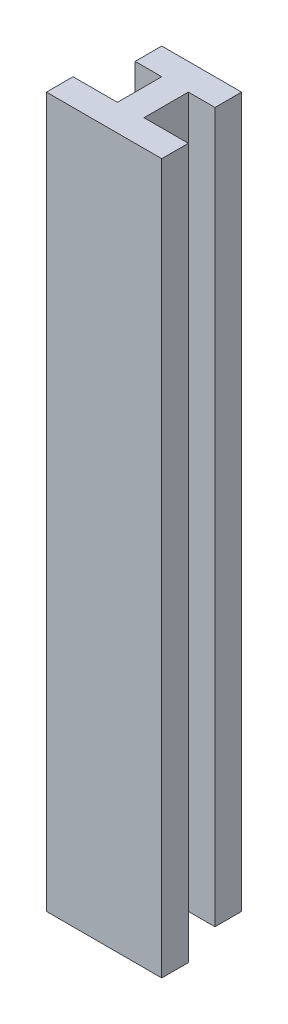
ISO-10303-21;
HEADER;
FILE_DESCRIPTION(('STEP AP214'),'2;1');
FILE_NAME('part.step','',(''),(''),'','','');
FILE_SCHEMA(('AUTOMOTIVE_DESIGN { 1 0 10303 214 1 1 1 1 }'));
ENDSEC;
DATA;
#1=APPLICATION_CONTEXT('core data for automotive mechanical design processes');
#2=APPLICATION_PROTOCOL_DEFINITION('international standard','automotive_design',2000,#1);
#3=PRODUCT_CONTEXT('',#1,'mechanical');
#4=PRODUCT('Part','Part','',(#3));
#5=PRODUCT_RELATED_PRODUCT_CATEGORY('part','',(#4));
#6=PRODUCT_DEFINITION_FORMATION('','',#4);
#7=PRODUCT_DEFINITION_CONTEXT('part definition',#1,'design');
#8=PRODUCT_DEFINITION('design','',#6,#7);
#9=PRODUCT_DEFINITION_SHAPE('','',#8);
#10=(LENGTH_UNIT() NAMED_UNIT(*) SI_UNIT(.MILLI.,.METRE.));
#11=(NAMED_UNIT(*) PLANE_ANGLE_UNIT() SI_UNIT($,.RADIAN.));
#12=(NAMED_UNIT(*) SI_UNIT($,.STERADIAN.) SOLID_ANGLE_UNIT());
#13=UNCERTAINTY_MEASURE_WITH_UNIT(LENGTH_MEASURE(1.E-05),#10,'distance_accuracy_value','');
#14=(GEOMETRIC_REPRESENTATION_CONTEXT(3) GLOBAL_UNCERTAINTY_ASSIGNED_CONTEXT((#13)) GLOBAL_UNIT_ASSIGNED_CONTEXT((#10,
#11,#12)) REPRESENTATION_CONTEXT('',''));
#15=CARTESIAN_POINT('',(0.,0.,0.));
#16=DIRECTION('',(0.,0.,1.));
#17=DIRECTION('',(1.,0.,0.));
#18=AXIS2_PLACEMENT_3D('',#15,#16,#17);
#19=CARTESIAN_POINT('',(0.,80.,0.));
#20=DIRECTION('',(1.,0.,0.));
#21=DIRECTION('',(0.,0.,-1.));
#22=AXIS2_PLACEMENT_3D('',#19,#20,#21);
#23=PLANE('',#22);
#24=DIRECTION('',(0.,0.,1.));
#25=VECTOR('',#24,1.);
#26=CARTESIAN_POINT('',(0.,0.,0.));
#27=LINE('',#26,#25);
#28=CARTESIAN_POINT('',(0.,0.,-3.));
#29=VERTEX_POINT('',#28);
#30=CARTESIAN_POINT('',(0.,0.,0.));
#31=VERTEX_POINT('',#30);
#32=EDGE_CURVE('E168',#29,#31,#27,.T.);
#33=ORIENTED_EDGE('',*,*,#32,.T.);
#34=DIRECTION('',(0.,-1.,0.));
#35=VECTOR('',#34,1.);
#36=CARTESIAN_POINT('',(0.,80.,0.));
#37=LINE('',#36,#35);
#38=CARTESIAN_POINT('',(0.,80.,0.));
#39=VERTEX_POINT('',#38);
#40=EDGE_CURVE('E11',#39,#31,#37,.T.);
#41=ORIENTED_EDGE('',*,*,#40,.F.);
#42=DIRECTION('',(0.,0.,1.));
#43=VECTOR('',#42,1.);
#44=CARTESIAN_POINT('',(0.,80.,0.));
#45=LINE('',#44,#43);
#46=CARTESIAN_POINT('',(0.,80.,-3.));
#47=VERTEX_POINT('',#46);
#48=EDGE_CURVE('E202',#47,#39,#45,.T.);
#49=ORIENTED_EDGE('',*,*,#48,.F.);
#50=DIRECTION('',(0.,-1.,0.));
#51=VECTOR('',#50,1.);
#52=CARTESIAN_POINT('',(0.,80.,-3.));
#53=LINE('',#52,#51);
#54=EDGE_CURVE('E164',#47,#29,#53,.T.);
#55=ORIENTED_EDGE('',*,*,#54,.T.);
#56=EDGE_LOOP('',(#33,#41,#49,#55));
#57=FACE_BOUND('',#56,.T.);
#58=ADVANCED_FACE('F43',(#57),#23,.F.);
#59=CARTESIAN_POINT('',(0.,80.,0.));
#60=DIRECTION('',(0.,0.,-1.));
#61=DIRECTION('',(-1.,0.,0.));
#62=AXIS2_PLACEMENT_3D('',#59,#60,#61);
#63=PLANE('',#62);
#64=DIRECTION('',(1.,0.,0.));
#65=VECTOR('',#64,1.);
#66=CARTESIAN_POINT('',(0.,0.,0.));
#67=LINE('',#66,#65);
#68=CARTESIAN_POINT('',(13.,0.,0.));
#69=VERTEX_POINT('',#68);
#70=EDGE_CURVE('E172',#31,#69,#67,.T.);
#71=ORIENTED_EDGE('',*,*,#70,.T.);
#72=DIRECTION('',(0.,-1.,0.));
#73=VECTOR('',#72,1.);
#74=CARTESIAN_POINT('',(13.,80.,0.));
#75=LINE('',#74,#73);
#76=CARTESIAN_POINT('',(13.,80.,0.));
#77=VERTEX_POINT('',#76);
#78=EDGE_CURVE('E52',#77,#69,#75,.T.);
#79=ORIENTED_EDGE('',*,*,#78,.F.);
#80=DIRECTION('',(1.,0.,0.));
#81=VECTOR('',#80,1.);
#82=CARTESIAN_POINT('',(0.,80.,0.));
#83=LINE('',#82,#81);
#84=EDGE_CURVE('E115',#39,#77,#83,.T.);
#85=ORIENTED_EDGE('',*,*,#84,.F.);
#86=ORIENTED_EDGE('',*,*,#40,.T.);
#87=EDGE_LOOP('',(#71,#79,#85,#86));
#88=FACE_BOUND('',#87,.T.);
#89=ADVANCED_FACE('F296',(#88),#63,.F.);
#90=CARTESIAN_POINT('',(13.,80.,0.));
#91=DIRECTION('',(-1.,0.,0.));
#92=DIRECTION('',(0.,0.,1.));
#93=AXIS2_PLACEMENT_3D('',#90,#91,#92);
#94=PLANE('',#93);
#95=DIRECTION('',(0.,0.,-1.));
#96=VECTOR('',#95,1.);
#97=CARTESIAN_POINT('',(13.,0.,0.));
#98=LINE('',#97,#96);
#99=CARTESIAN_POINT('',(13.,0.,-3.));
#100=VERTEX_POINT('',#99);
#101=EDGE_CURVE('E175',#69,#100,#98,.T.);
#102=ORIENTED_EDGE('',*,*,#101,.T.);
#103=DIRECTION('',(0.,-1.,0.));
#104=VECTOR('',#103,1.);
#105=CARTESIAN_POINT('',(13.,80.,-3.));
#106=LINE('',#105,#104);
#107=CARTESIAN_POINT('',(13.,80.,-3.));
#108=VERTEX_POINT('',#107);
#109=EDGE_CURVE('E229',#108,#100,#106,.T.);
#110=ORIENTED_EDGE('',*,*,#109,.F.);
#111=DIRECTION('',(0.,0.,-1.));
#112=VECTOR('',#111,1.);
#113=CARTESIAN_POINT('',(13.,80.,0.));
#114=LINE('',#113,#112);
#115=EDGE_CURVE('E239',#77,#108,#114,.T.);
#116=ORIENTED_EDGE('',*,*,#115,.F.);
#117=ORIENTED_EDGE('',*,*,#78,.T.);
#118=EDGE_LOOP('',(#102,#110,#116,#117));
#119=FACE_BOUND('',#118,.T.);
#120=ADVANCED_FACE('F237',(#119),#94,.F.);
#121=CARTESIAN_POINT('',(13.,80.,-3.));
#122=DIRECTION('',(0.,0.,1.));
#123=DIRECTION('',(1.,0.,0.));
#124=AXIS2_PLACEMENT_3D('',#121,#122,#123);
#125=PLANE('',#124);
#126=DIRECTION('',(-1.,0.,0.));
#127=VECTOR('',#126,1.);
#128=CARTESIAN_POINT('',(13.,0.,-3.));
#129=LINE('',#128,#127);
#130=CARTESIAN_POINT('',(8.,0.,-3.));
#131=VERTEX_POINT('',#130);
#132=EDGE_CURVE('E178',#100,#131,#129,.T.);
#133=ORIENTED_EDGE('',*,*,#132,.T.);
#134=DIRECTION('',(0.,-1.,0.));
#135=VECTOR('',#134,1.);
#136=CARTESIAN_POINT('',(8.,80.,-3.));
#137=LINE('',#136,#135);
#138=CARTESIAN_POINT('',(8.,80.,-3.));
#139=VERTEX_POINT('',#138);
#140=EDGE_CURVE('E225',#139,#131,#137,.T.);
#141=ORIENTED_EDGE('',*,*,#140,.F.);
#142=DIRECTION('',(-1.,0.,0.));
#143=VECTOR('',#142,1.);
#144=CARTESIAN_POINT('',(13.,80.,-3.));
#145=LINE('',#144,#143);
#146=EDGE_CURVE('E258',#108,#139,#145,.T.);
#147=ORIENTED_EDGE('',*,*,#146,.F.);
#148=ORIENTED_EDGE('',*,*,#109,.T.);
#149=EDGE_LOOP('',(#133,#141,#147,#148));
#150=FACE_BOUND('',#149,.T.);
#151=ADVANCED_FACE('F248',(#150),#125,.F.);
#152=CARTESIAN_POINT('',(8.,80.,-3.));
#153=DIRECTION('',(-1.,0.,0.));
#154=DIRECTION('',(0.,0.,1.));
#155=AXIS2_PLACEMENT_3D('',#152,#153,#154);
#156=PLANE('',#155);
#157=DIRECTION('',(0.,0.,-1.));
#158=VECTOR('',#157,1.);
#159=CARTESIAN_POINT('',(8.,0.,-3.));
#160=LINE('',#159,#158);
#161=CARTESIAN_POINT('',(8.,0.,-8.));
#162=VERTEX_POINT('',#161);
#163=EDGE_CURVE('E181',#131,#162,#160,.T.);
#164=ORIENTED_EDGE('',*,*,#163,.T.);
#165=DIRECTION('',(0.,-1.,0.));
#166=VECTOR('',#165,1.);
#167=CARTESIAN_POINT('',(8.,80.,-8.));
#168=LINE('',#167,#166);
#169=CARTESIAN_POINT('',(8.,80.,-8.));
#170=VERTEX_POINT('',#169);
#171=EDGE_CURVE('E221',#170,#162,#168,.T.);
#172=ORIENTED_EDGE('',*,*,#171,.F.);
#173=DIRECTION('',(0.,0.,-1.));
#174=VECTOR('',#173,1.);
#175=CARTESIAN_POINT('',(8.,80.,-3.));
#176=LINE('',#175,#174);
#177=EDGE_CURVE('E254',#139,#170,#176,.T.);
#178=ORIENTED_EDGE('',*,*,#177,.F.);
#179=ORIENTED_EDGE('',*,*,#140,.T.);
#180=EDGE_LOOP('',(#164,#172,#178,#179));
#181=FACE_BOUND('',#180,.T.);
#182=ADVANCED_FACE('F252',(#181),#156,.F.);
#183=CARTESIAN_POINT('',(8.,80.,-8.));
#184=DIRECTION('',(0.,0.,-1.));
#185=DIRECTION('',(-1.,0.,0.));
#186=AXIS2_PLACEMENT_3D('',#183,#184,#185);
#187=PLANE('',#186);
#188=DIRECTION('',(1.,0.,0.));
#189=VECTOR('',#188,1.);
#190=CARTESIAN_POINT('',(8.,0.,-8.));
#191=LINE('',#190,#189);
#192=CARTESIAN_POINT('',(11.,0.,-8.));
#193=VERTEX_POINT('',#192);
#194=EDGE_CURVE('E184',#162,#193,#191,.T.);
#195=ORIENTED_EDGE('',*,*,#194,.T.);
#196=DIRECTION('',(0.,-1.,0.));
#197=VECTOR('',#196,1.);
#198=CARTESIAN_POINT('',(11.,80.,-8.));
#199=LINE('',#198,#197);
#200=CARTESIAN_POINT('',(11.,80.,-8.));
#201=VERTEX_POINT('',#200);
#202=EDGE_CURVE('E217',#201,#193,#199,.T.);
#203=ORIENTED_EDGE('',*,*,#202,.F.);
#204=DIRECTION('',(1.,0.,0.));
#205=VECTOR('',#204,1.);
#206=CARTESIAN_POINT('',(8.,80.,-8.));
#207=LINE('',#206,#205);
#208=EDGE_CURVE('E257',#170,#201,#207,.T.);
#209=ORIENTED_EDGE('',*,*,#208,.F.);
#210=ORIENTED_EDGE('',*,*,#171,.T.);
#211=EDGE_LOOP('',(#195,#203,#209,#210));
#212=FACE_BOUND('',#211,.T.);
#213=ADVANCED_FACE('F309',(#212),#187,.F.);
#214=CARTESIAN_POINT('',(11.,80.,-8.));
#215=DIRECTION('',(-1.,0.,0.));
#216=DIRECTION('',(0.,0.,1.));
#217=AXIS2_PLACEMENT_3D('',#214,#215,#216);
#218=PLANE('',#217);
#219=DIRECTION('',(0.,0.,-1.));
#220=VECTOR('',#219,1.);
#221=CARTESIAN_POINT('',(11.,0.,-8.));
#222=LINE('',#221,#220);
#223=CARTESIAN_POINT('',(11.,0.,-11.));
#224=VERTEX_POINT('',#223);
#225=EDGE_CURVE('E187',#193,#224,#222,.T.);
#226=ORIENTED_EDGE('',*,*,#225,.T.);
#227=DIRECTION('',(0.,-1.,0.));
#228=VECTOR('',#227,1.);
#229=CARTESIAN_POINT('',(11.,80.,-11.));
#230=LINE('',#229,#228);
#231=CARTESIAN_POINT('',(11.,80.,-11.));
#232=VERTEX_POINT('',#231);
#233=EDGE_CURVE('E213',#232,#224,#230,.T.);
#234=ORIENTED_EDGE('',*,*,#233,.F.);
#235=DIRECTION('',(0.,0.,-1.));
#236=VECTOR('',#235,1.);
#237=CARTESIAN_POINT('',(11.,80.,-8.));
#238=LINE('',#237,#236);
#239=EDGE_CURVE('E262',#201,#232,#238,.T.);
#240=ORIENTED_EDGE('',*,*,#239,.F.);
#241=ORIENTED_EDGE('',*,*,#202,.T.);
#242=EDGE_LOOP('',(#226,#234,#240,#241));
#243=FACE_BOUND('',#242,.T.);
#244=ADVANCED_FACE('F312',(#243),#218,.F.);
#245=CARTESIAN_POINT('',(11.,80.,-11.));
#246=DIRECTION('',(0.,0.,1.));
#247=DIRECTION('',(1.,0.,0.));
#248=AXIS2_PLACEMENT_3D('',#245,#246,#247);
#249=PLANE('',#248);
#250=DIRECTION('',(-1.,0.,0.));
#251=VECTOR('',#250,1.);
#252=CARTESIAN_POINT('',(11.,0.,-11.));
#253=LINE('',#252,#251);
#254=CARTESIAN_POINT('',(2.,0.,-11.));
#255=VERTEX_POINT('',#254);
#256=EDGE_CURVE('E190',#224,#255,#253,.T.);
#257=ORIENTED_EDGE('',*,*,#256,.T.);
#258=DIRECTION('',(0.,-1.,0.));
#259=VECTOR('',#258,1.);
#260=CARTESIAN_POINT('',(2.,80.,-11.));
#261=LINE('',#260,#259);
#262=CARTESIAN_POINT('',(2.,80.,-11.));
#263=VERTEX_POINT('',#262);
#264=EDGE_CURVE('E209',#263,#255,#261,.T.);
#265=ORIENTED_EDGE('',*,*,#264,.F.);
#266=DIRECTION('',(-1.,0.,0.));
#267=VECTOR('',#266,1.);
#268=CARTESIAN_POINT('',(11.,80.,-11.));
#269=LINE('',#268,#267);
#270=EDGE_CURVE('E269',#232,#263,#269,.T.);
#271=ORIENTED_EDGE('',*,*,#270,.F.);
#272=ORIENTED_EDGE('',*,*,#233,.T.);
#273=EDGE_LOOP('',(#257,#265,#271,#272));
#274=FACE_BOUND('',#273,.T.);
#275=ADVANCED_FACE('F277',(#274),#249,.F.);
#276=CARTESIAN_POINT('',(2.,80.,-11.));
#277=DIRECTION('',(1.,0.,0.));
#278=DIRECTION('',(0.,0.,-1.));
#279=AXIS2_PLACEMENT_3D('',#276,#277,#278);
#280=PLANE('',#279);
#281=DIRECTION('',(0.,0.,1.));
#282=VECTOR('',#281,1.);
#283=CARTESIAN_POINT('',(2.,0.,-11.));
#284=LINE('',#283,#282);
#285=CARTESIAN_POINT('',(2.,0.,-8.));
#286=VERTEX_POINT('',#285);
#287=EDGE_CURVE('E193',#255,#286,#284,.T.);
#288=ORIENTED_EDGE('',*,*,#287,.T.);
#289=DIRECTION('',(0.,-1.,0.));
#290=VECTOR('',#289,1.);
#291=CARTESIAN_POINT('',(2.,80.,-8.));
#292=LINE('',#291,#290);
#293=CARTESIAN_POINT('',(2.,80.,-8.));
#294=VERTEX_POINT('',#293);
#295=EDGE_CURVE('E157',#294,#286,#292,.T.);
#296=ORIENTED_EDGE('',*,*,#295,.F.);
#297=DIRECTION('',(0.,0.,1.));
#298=VECTOR('',#297,1.);
#299=CARTESIAN_POINT('',(2.,80.,-11.));
#300=LINE('',#299,#298);
#301=EDGE_CURVE('E146',#263,#294,#300,.T.);
#302=ORIENTED_EDGE('',*,*,#301,.F.);
#303=ORIENTED_EDGE('',*,*,#264,.T.);
#304=EDGE_LOOP('',(#288,#296,#302,#303));
#305=FACE_BOUND('',#304,.T.);
#306=ADVANCED_FACE('F281',(#305),#280,.F.);
#307=CARTESIAN_POINT('',(2.,80.,-8.));
#308=DIRECTION('',(0.,0.,-1.));
#309=DIRECTION('',(-1.,0.,0.));
#310=AXIS2_PLACEMENT_3D('',#307,#308,#309);
#311=PLANE('',#310);
#312=DIRECTION('',(1.,0.,0.));
#313=VECTOR('',#312,1.);
#314=CARTESIAN_POINT('',(2.,0.,-8.));
#315=LINE('',#314,#313);
#316=CARTESIAN_POINT('',(5.,0.,-8.));
#317=VERTEX_POINT('',#316);
#318=EDGE_CURVE('E155',#286,#317,#315,.T.);
#319=ORIENTED_EDGE('',*,*,#318,.T.);
#320=DIRECTION('',(0.,-1.,0.));
#321=VECTOR('',#320,1.);
#322=CARTESIAN_POINT('',(5.,80.,-8.));
#323=LINE('',#322,#321);
#324=CARTESIAN_POINT('',(5.,80.,-8.));
#325=VERTEX_POINT('',#324);
#326=EDGE_CURVE('E152',#325,#317,#323,.T.);
#327=ORIENTED_EDGE('',*,*,#326,.F.);
#328=DIRECTION('',(1.,0.,0.));
#329=VECTOR('',#328,1.);
#330=CARTESIAN_POINT('',(2.,80.,-8.));
#331=LINE('',#330,#329);
#332=EDGE_CURVE('E140',#294,#325,#331,.T.);
#333=ORIENTED_EDGE('',*,*,#332,.F.);
#334=ORIENTED_EDGE('',*,*,#295,.T.);
#335=EDGE_LOOP('',(#319,#327,#333,#334));
#336=FACE_BOUND('',#335,.T.);
#337=ADVANCED_FACE('F153',(#336),#311,.F.);
#338=CARTESIAN_POINT('',(5.,80.,-3.));
#339=DIRECTION('',(1.,0.,0.));
#340=DIRECTION('',(0.,0.,-1.));
#341=AXIS2_PLACEMENT_3D('',#338,#339,#340);
#342=PLANE('',#341);
#343=DIRECTION('',(0.,0.,1.));
#344=VECTOR('',#343,1.);
#345=CARTESIAN_POINT('',(5.,0.,-3.));
#346=LINE('',#345,#344);
#347=CARTESIAN_POINT('',(5.,0.,-3.));
#348=VERTEX_POINT('',#347);
#349=EDGE_CURVE('E101',#317,#348,#346,.T.);
#350=ORIENTED_EDGE('',*,*,#349,.T.);
#351=DIRECTION('',(0.,-1.,0.));
#352=VECTOR('',#351,1.);
#353=CARTESIAN_POINT('',(5.,80.,-3.));
#354=LINE('',#353,#352);
#355=CARTESIAN_POINT('',(5.,80.,-3.));
#356=VERTEX_POINT('',#355);
#357=EDGE_CURVE('E158',#356,#348,#354,.T.);
#358=ORIENTED_EDGE('',*,*,#357,.F.);
#359=DIRECTION('',(0.,0.,1.));
#360=VECTOR('',#359,1.);
#361=CARTESIAN_POINT('',(5.,80.,-3.));
#362=LINE('',#361,#360);
#363=EDGE_CURVE('E144',#325,#356,#362,.T.);
#364=ORIENTED_EDGE('',*,*,#363,.F.);
#365=ORIENTED_EDGE('',*,*,#326,.T.);
#366=EDGE_LOOP('',(#350,#358,#364,#365));
#367=FACE_BOUND('',#366,.T.);
#368=ADVANCED_FACE('F160',(#367),#342,.F.);
#369=CARTESIAN_POINT('',(0.,80.,-3.));
#370=DIRECTION('',(0.,0.,1.));
#371=DIRECTION('',(1.,0.,0.));
#372=AXIS2_PLACEMENT_3D('',#369,#370,#371);
#373=PLANE('',#372);
#374=DIRECTION('',(-1.,0.,0.));
#375=VECTOR('',#374,1.);
#376=CARTESIAN_POINT('',(0.,0.,-3.));
#377=LINE('',#376,#375);
#378=EDGE_CURVE('E107',#348,#29,#377,.T.);
#379=ORIENTED_EDGE('',*,*,#378,.T.);
#380=ORIENTED_EDGE('',*,*,#54,.F.);
#381=DIRECTION('',(-1.,0.,0.));
#382=VECTOR('',#381,1.);
#383=CARTESIAN_POINT('',(0.,80.,-3.));
#384=LINE('',#383,#382);
#385=EDGE_CURVE('E60',#356,#47,#384,.T.);
#386=ORIENTED_EDGE('',*,*,#385,.F.);
#387=ORIENTED_EDGE('',*,*,#357,.T.);
#388=EDGE_LOOP('',(#379,#380,#386,#387));
#389=FACE_BOUND('',#388,.T.);
#390=ADVANCED_FACE('F285',(#389),#373,.F.);
#391=CARTESIAN_POINT('',(0.,80.,0.));
#392=DIRECTION('',(0.,-1.,0.));
#393=DIRECTION('',(0.,0.,-1.));
#394=AXIS2_PLACEMENT_3D('',#391,#392,#393);
#395=PLANE('',#394);
#396=ORIENTED_EDGE('',*,*,#48,.T.);
#397=ORIENTED_EDGE('',*,*,#84,.T.);
#398=ORIENTED_EDGE('',*,*,#115,.T.);
#399=ORIENTED_EDGE('',*,*,#146,.T.);
#400=ORIENTED_EDGE('',*,*,#177,.T.);
#401=ORIENTED_EDGE('',*,*,#208,.T.);
#402=ORIENTED_EDGE('',*,*,#239,.T.);
#403=ORIENTED_EDGE('',*,*,#270,.T.);
#404=ORIENTED_EDGE('',*,*,#301,.T.);
#405=ORIENTED_EDGE('',*,*,#332,.T.);
#406=ORIENTED_EDGE('',*,*,#363,.T.);
#407=ORIENTED_EDGE('',*,*,#385,.T.);
#408=EDGE_LOOP('',(#396,#397,#398,#399,#400,#401,#402,#403,#404,#405,#406,#407));
#409=FACE_BOUND('',#408,.T.);
#410=ADVANCED_FACE('F142',(#409),#395,.F.);
#411=CARTESIAN_POINT('',(0.,0.,0.));
#412=DIRECTION('',(0.,-1.,0.));
#413=DIRECTION('',(0.,0.,-1.));
#414=AXIS2_PLACEMENT_3D('',#411,#412,#413);
#415=PLANE('',#414);
#416=ORIENTED_EDGE('',*,*,#32,.F.);
#417=ORIENTED_EDGE('',*,*,#378,.F.);
#418=ORIENTED_EDGE('',*,*,#349,.F.);
#419=ORIENTED_EDGE('',*,*,#318,.F.);
#420=ORIENTED_EDGE('',*,*,#287,.F.);
#421=ORIENTED_EDGE('',*,*,#256,.F.);
#422=ORIENTED_EDGE('',*,*,#225,.F.);
#423=ORIENTED_EDGE('',*,*,#194,.F.);
#424=ORIENTED_EDGE('',*,*,#163,.F.);
#425=ORIENTED_EDGE('',*,*,#132,.F.);
#426=ORIENTED_EDGE('',*,*,#101,.F.);
#427=ORIENTED_EDGE('',*,*,#70,.F.);
#428=EDGE_LOOP('',(#416,#417,#418,#419,#420,#421,#422,#423,#424,#425,#426,#427));
#429=FACE_BOUND('',#428,.T.);
#430=ADVANCED_FACE('F243',(#429),#415,.T.);
#431=CLOSED_SHELL('',(#58,#89,#120,#151,#182,#213,#244,#275,#306,#337,#368,#390,#410,#430));
#432=MANIFOLD_SOLID_BREP('B2',#431);
#433=ADVANCED_BREP_SHAPE_REPRESENTATION('',(#18,#432),#14);
#434=SHAPE_DEFINITION_REPRESENTATION(#9,#433);
ENDSEC;
END-ISO-10303-21;
